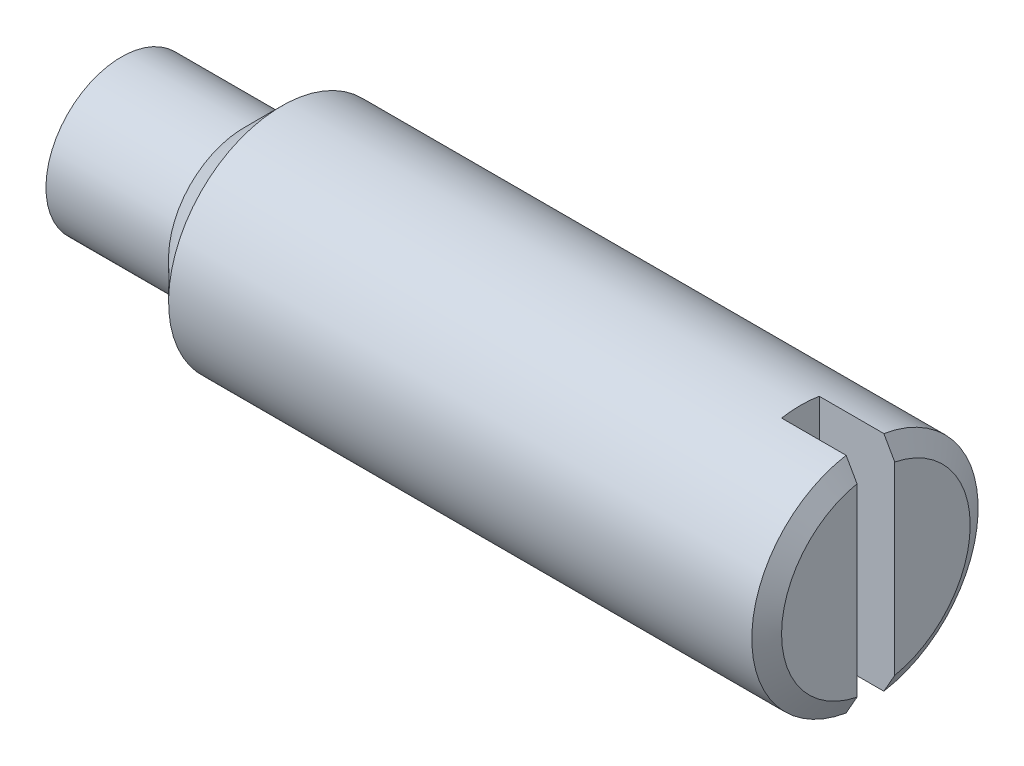
ISO-10303-21;
HEADER;
FILE_DESCRIPTION(('STEP AP214'),'2;1');
FILE_NAME('part.step','',(''),(''),'','','');
FILE_SCHEMA(('AUTOMOTIVE_DESIGN { 1 0 10303 214 1 1 1 1 }'));
ENDSEC;
DATA;
#1=APPLICATION_CONTEXT('core data for automotive mechanical design processes');
#2=APPLICATION_PROTOCOL_DEFINITION('international standard','automotive_design',2000,#1);
#3=PRODUCT_CONTEXT('',#1,'mechanical');
#4=PRODUCT('Part','Part','',(#3));
#5=PRODUCT_RELATED_PRODUCT_CATEGORY('part','',(#4));
#6=PRODUCT_DEFINITION_FORMATION('','',#4);
#7=PRODUCT_DEFINITION_CONTEXT('part definition',#1,'design');
#8=PRODUCT_DEFINITION('design','',#6,#7);
#9=PRODUCT_DEFINITION_SHAPE('','',#8);
#10=(LENGTH_UNIT() NAMED_UNIT(*) SI_UNIT(.MILLI.,.METRE.));
#11=(NAMED_UNIT(*) PLANE_ANGLE_UNIT() SI_UNIT($,.RADIAN.));
#12=(NAMED_UNIT(*) SI_UNIT($,.STERADIAN.) SOLID_ANGLE_UNIT());
#13=UNCERTAINTY_MEASURE_WITH_UNIT(LENGTH_MEASURE(1.E-05),#10,'distance_accuracy_value','');
#14=(GEOMETRIC_REPRESENTATION_CONTEXT(3) GLOBAL_UNCERTAINTY_ASSIGNED_CONTEXT((#13)) GLOBAL_UNIT_ASSIGNED_CONTEXT((#10,
#11,#12)) REPRESENTATION_CONTEXT('',''));
#15=CARTESIAN_POINT('',(0.,0.,0.));
#16=DIRECTION('',(0.,0.,1.));
#17=DIRECTION('',(1.,0.,0.));
#18=AXIS2_PLACEMENT_3D('',#15,#16,#17);
#19=CARTESIAN_POINT('',(0.,0.,0.));
#20=DIRECTION('',(-1.,0.,0.));
#21=DIRECTION('',(0.,-1.,0.));
#22=AXIS2_PLACEMENT_3D('',#19,#20,#21);
#23=PLANE('',#22);
#24=CARTESIAN_POINT('',(0.,0.,0.));
#25=DIRECTION('',(-1.,0.,0.));
#26=DIRECTION('',(0.,-1.,0.));
#27=AXIS2_PLACEMENT_3D('',#24,#25,#26);
#28=CIRCLE('',#27,2.5);
#29=CARTESIAN_POINT('',(0.,2.44948974278318,0.5));
#30=VERTEX_POINT('',#29);
#31=CARTESIAN_POINT('',(0.,-2.44948974278318,0.5));
#32=VERTEX_POINT('',#31);
#33=EDGE_CURVE('E97',#30,#32,#28,.F.);
#34=ORIENTED_EDGE('',*,*,#33,.T.);
#35=DIRECTION('',(0.,-1.,0.));
#36=VECTOR('',#35,1.);
#37=CARTESIAN_POINT('',(0.,3.,0.5));
#38=LINE('',#37,#36);
#39=EDGE_CURVE('E88',#30,#32,#38,.T.);
#40=ORIENTED_EDGE('',*,*,#39,.F.);
#41=EDGE_LOOP('',(#34,#40));
#42=FACE_BOUND('',#41,.T.);
#43=ADVANCED_FACE('F34',(#42),#23,.F.);
#44=CARTESIAN_POINT('',(-0.28867513459481,0.,0.));
#45=DIRECTION('',(-1.,0.,0.));
#46=DIRECTION('',(0.,-1.,0.));
#47=AXIS2_PLACEMENT_3D('',#44,#45,#46);
#48=CONICAL_SURFACE('',#47,3.,1.0471975511966);
#49=CARTESIAN_POINT('',(-2.38056763443478,6.60436425818802,0.500000000000001));
#50=CARTESIAN_POINT('',(-2.21987851924146,6.32523174882968,0.500000000000001));
#51=CARTESIAN_POINT('',(-2.05922157360592,6.04608066376051,0.500000000000001));
#52=CARTESIAN_POINT('',(-1.73804009670836,5.48769972280962,0.500000000000001));
#53=CARTESIAN_POINT('',(-1.57751556638557,5.20846986638771,0.500000000000001));
#54=CARTESIAN_POINT('',(-1.2565407328157,4.64966993381109,0.500000000000001));
#55=CARTESIAN_POINT('',(-1.09609059207058,4.37009976431178,0.500000000000001));
#56=CARTESIAN_POINT('',(-0.775536998569064,3.81076267874013,0.500000000000001));
#57=CARTESIAN_POINT('',(-0.615433543798454,3.53099576382344,0.5));
#58=CARTESIAN_POINT('',(-0.37637577587422,3.1120600016948,0.5));
#59=CARTESIAN_POINT('',(-0.297160111622826,2.97304032569814,0.5));
#60=CARTESIAN_POINT('',(-0.138988420983219,2.69485088787921,0.5));
#61=CARTESIAN_POINT('',(-0.0600323978569311,2.5556811242003,0.5));
#62=CARTESIAN_POINT('',(0.0974311986749842,2.27716790935011,0.5));
#63=CARTESIAN_POINT('',(0.175938952012067,2.13782455990923,0.5));
#64=CARTESIAN_POINT('',(0.332254601845675,1.8587504123645,0.5));
#65=CARTESIAN_POINT('',(0.410062522323292,1.71901962775318,0.5));
#66=CARTESIAN_POINT('',(0.52595587984706,1.50844816355613,0.5));
#67=CARTESIAN_POINT('',(0.564559286690378,1.43789288413285,0.5));
#68=CARTESIAN_POINT('',(0.641236776283347,1.29648675145502,0.5));
#69=CARTESIAN_POINT('',(0.679310815624552,1.22563587457343,0.5));
#70=CARTESIAN_POINT('',(0.754664782912789,1.08340551184132,0.5));
#71=CARTESIAN_POINT('',(0.791943721669441,1.01202550124295,0.5));
#72=CARTESIAN_POINT('',(0.865095276164039,0.868553497767773,0.5));
#73=CARTESIAN_POINT('',(0.900968141774855,0.796461634271076,0.5));
#74=CARTESIAN_POINT('',(0.95325850720774,0.686355987251272,0.5));
#75=CARTESIAN_POINT('',(0.970657040026667,0.64881097974156,0.5));
#76=CARTESIAN_POINT('',(1.00441838986475,0.573260592211893,0.5));
#77=CARTESIAN_POINT('',(1.02078132716098,0.535255266267751,0.5));
#78=CARTESIAN_POINT('',(1.05197331628164,0.458611875476108,0.5));
#79=CARTESIAN_POINT('',(1.06680257582864,0.419973897138829,0.5));
#80=CARTESIAN_POINT('',(1.09412756543042,0.341898309282545,0.5));
#81=CARTESIAN_POINT('',(1.10662424680626,0.302461033057007,0.5));
#82=CARTESIAN_POINT('',(1.13202721426478,0.207690397932789,0.5));
#83=CARTESIAN_POINT('',(1.14336747266767,0.151884665807046,0.5));
#84=CARTESIAN_POINT('',(1.15251769446273,0.0675083293957488,0.5));
#85=CARTESIAN_POINT('',(1.15426479869432,0.0393658599237505,0.5));
#86=CARTESIAN_POINT('',(1.15499132940951,-0.0169564875639498,0.5));
#87=CARTESIAN_POINT('',(1.15397080971083,-0.0451363648415895,0.5));
#88=CARTESIAN_POINT('',(1.14864112458689,-0.108852409201647,0.5));
#89=CARTESIAN_POINT('',(1.14351808647759,-0.144319501299168,0.5));
#90=CARTESIAN_POINT('',(1.12982343725853,-0.214588356873687,0.5));
#91=CARTESIAN_POINT('',(1.12124780317403,-0.249389294419736,0.5));
#92=CARTESIAN_POINT('',(1.10148661898386,-0.318726555770894,0.5));
#93=CARTESIAN_POINT('',(1.09026759135053,-0.353253062499702,0.5));
#94=CARTESIAN_POINT('',(1.06607493505895,-0.421660567235601,0.5));
#95=CARTESIAN_POINT('',(1.05310187440813,-0.455541770175561,0.5));
#96=CARTESIAN_POINT('',(1.02462222438818,-0.526079769021435,0.5));
#97=CARTESIAN_POINT('',(1.00899194292068,-0.56268607164306,0.5));
#98=CARTESIAN_POINT('',(0.976732347993736,-0.635458018455982,0.5));
#99=CARTESIAN_POINT('',(0.960102882364957,-0.671623594513533,0.5));
#100=CARTESIAN_POINT('',(0.909170463866859,-0.779665629677986,0.5));
#101=CARTESIAN_POINT('',(0.873837648323284,-0.851054129687489,0.5));
#102=CARTESIAN_POINT('',(0.801677165617376,-0.993202284908412,0.5));
#103=CARTESIAN_POINT('',(0.764847206453908,-1.06396075698513,0.5));
#104=CARTESIAN_POINT('',(0.690333807657301,-1.20499954369713,0.5));
#105=CARTESIAN_POINT('',(0.65265062439121,-1.27527999392158,0.5));
#106=CARTESIAN_POINT('',(0.576944940152225,-1.41516530621858,0.5));
#107=CARTESIAN_POINT('',(0.538925379534828,-1.48477176605077,0.5));
#108=CARTESIAN_POINT('',(0.462518575506405,-1.62378929563115,0.5));
#109=CARTESIAN_POINT('',(0.424131304361786,-1.69320035012234,0.5));
#110=CARTESIAN_POINT('',(0.308667411284188,-1.90108807371719,0.5));
#111=CARTESIAN_POINT('',(0.231214382532965,-2.03935544336329,0.5));
#112=CARTESIAN_POINT('',(0.0495084258521245,-2.36226425098842,0.5));
#113=CARTESIAN_POINT('',(-0.0549557382650398,-2.54678651233472,0.5));
#114=CARTESIAN_POINT('',(-0.264386143908598,-2.9155482780008,0.5));
#115=CARTESIAN_POINT('',(-0.369352391041683,-3.09978777913254,0.5));
#116=CARTESIAN_POINT('',(-0.684766827992471,-3.65241366414568,0.5));
#117=CARTESIAN_POINT('',(-0.895644275983684,-4.02055488747794,0.5));
#118=CARTESIAN_POINT('',(-1.31876314392062,-4.75813872384968,0.499999999999999));
#119=CARTESIAN_POINT('',(-1.53100654689369,-5.12758019749782,0.499999999999999));
#120=CARTESIAN_POINT('',(-1.95567562843016,-5.86614368002851,0.499999999999999));
#121=CARTESIAN_POINT('',(-2.16810118687258,-6.23526575796588,0.499999999999999));
#122=CARTESIAN_POINT('',(-2.38056763443478,-6.60436425818802,0.499999999999999));
#123=B_SPLINE_CURVE_WITH_KNOTS('',3,(#49,#50,#51,#52,#53,#54,#55,#56,#57,#58,#59,#60,#61,#62,
#63,#64,#65,#66,#67,#68,#69,#70,#71,#72,#73,#74,#75,#76,#77,#78,#79,#80,#81,#82,#83,#84,#85,#86,
#87,#88,#89,#90,#91,#92,#93,#94,#95,#96,#97,#98,#99,#100,#101,#102,#103,#104,#105,#106,#107,
#108,#109,#110,#111,#112,#113,#114,#115,#116,#117,#118,#119,#120,#121,#122),.UNSPECIFIED.,.F.,
.F.,(4,2,2,2,2,2,2,2,2,2,2,2,2,2,2,2,2,2,2,2,2,2,2,2,2,2,2,2,2,2,2,2,2,2,2,2,4),(0.,
0.966242049970543,1.93249089559998,2.89951386216376,3.86653119523923,4.34654597828595,
4.82656676899447,5.3063790081358,5.78617474248225,6.02745018292905,6.26874529278308,
6.5103248919116,6.75186136353196,6.8759915655814,7.00010732423173,7.12420625046749,
7.24825445295119,7.41829563097937,7.50275875677017,7.58722024014838,7.69449663624357,
7.80189839455179,7.91074134434513,8.01954913163642,8.13893807988061,8.25834525660899,
8.49726798317976,8.73657137670712,8.97580379701663,9.21374141549945,9.45169712335604,
9.92714322687762,10.5632638036887,11.1993915006302,12.4721728808097,13.7503779958125,
15.0280247623734),.UNSPECIFIED.);
#124=CARTESIAN_POINT('',(-0.28867513459481,2.95803989154981,0.5));
#125=VERTEX_POINT('',#124);
#126=EDGE_CURVE('E85',#125,#30,#123,.T.);
#127=ORIENTED_EDGE('',*,*,#126,.F.);
#128=CARTESIAN_POINT('',(-0.28867513459481,0.,0.));
#129=DIRECTION('',(-1.,0.,0.));
#130=DIRECTION('',(0.,-1.,0.));
#131=AXIS2_PLACEMENT_3D('',#128,#129,#130);
#132=CIRCLE('',#131,3.);
#133=CARTESIAN_POINT('',(-0.288675134594809,-2.95803989154981,0.5));
#134=VERTEX_POINT('',#133);
#135=EDGE_CURVE('E101',#134,#125,#132,.T.);
#136=ORIENTED_EDGE('',*,*,#135,.F.);
#137=EDGE_CURVE('E94',#32,#134,#123,.T.);
#138=ORIENTED_EDGE('',*,*,#137,.F.);
#139=ORIENTED_EDGE('',*,*,#33,.F.);
#140=EDGE_LOOP('',(#127,#136,#138,#139));
#141=FACE_BOUND('',#140,.T.);
#142=ADVANCED_FACE('F99',(#141),#48,.T.);
#143=CARTESIAN_POINT('',(0.,-2.44948974278318,-0.5));
#144=VERTEX_POINT('',#143);
#145=CARTESIAN_POINT('',(0.,2.44948974278318,-0.5));
#146=VERTEX_POINT('',#145);
#147=EDGE_CURVE('E100',#144,#146,#28,.F.);
#148=ORIENTED_EDGE('',*,*,#147,.T.);
#149=DIRECTION('',(0.,1.,0.));
#150=VECTOR('',#149,1.);
#151=CARTESIAN_POINT('',(0.,3.,-0.5));
#152=LINE('',#151,#150);
#153=EDGE_CURVE('E50',#144,#146,#152,.T.);
#154=ORIENTED_EDGE('',*,*,#153,.F.);
#155=EDGE_LOOP('',(#148,#154));
#156=FACE_BOUND('',#155,.T.);
#157=ADVANCED_FACE('F140',(#156),#23,.F.);
#158=CARTESIAN_POINT('',(-20.,0.,0.));
#159=DIRECTION('',(-1.,0.,0.));
#160=DIRECTION('',(0.,-1.,0.));
#161=AXIS2_PLACEMENT_3D('',#158,#159,#160);
#162=CYLINDRICAL_SURFACE('',#161,3.);
#163=ORIENTED_EDGE('',*,*,#135,.T.);
#164=DIRECTION('',(-1.,0.,0.));
#165=VECTOR('',#164,1.);
#166=CARTESIAN_POINT('',(-20.,2.95803989154981,0.5));
#167=LINE('',#166,#165);
#168=CARTESIAN_POINT('',(-2.,2.95803989154981,0.5));
#169=VERTEX_POINT('',#168);
#170=EDGE_CURVE('E58',#125,#169,#167,.T.);
#171=ORIENTED_EDGE('',*,*,#170,.T.);
#172=CARTESIAN_POINT('',(-2.,0.,0.));
#173=DIRECTION('',(1.,0.,0.));
#174=DIRECTION('',(0.,0.,-1.));
#175=AXIS2_PLACEMENT_3D('',#172,#173,#174);
#176=CIRCLE('',#175,3.);
#177=CARTESIAN_POINT('',(-2.,2.95803989154981,-0.5));
#178=VERTEX_POINT('',#177);
#179=EDGE_CURVE('E11',#178,#169,#176,.T.);
#180=ORIENTED_EDGE('',*,*,#179,.F.);
#181=DIRECTION('',(-1.,0.,0.));
#182=VECTOR('',#181,1.);
#183=CARTESIAN_POINT('',(-20.,2.95803989154981,-0.5));
#184=LINE('',#183,#182);
#185=CARTESIAN_POINT('',(-0.28867513459481,2.95803989154981,-0.5));
#186=VERTEX_POINT('',#185);
#187=EDGE_CURVE('E208',#178,#186,#184,.F.);
#188=ORIENTED_EDGE('',*,*,#187,.T.);
#189=CARTESIAN_POINT('',(-0.288675134594809,-2.95803989154981,-0.5));
#190=VERTEX_POINT('',#189);
#191=EDGE_CURVE('E105',#186,#190,#132,.T.);
#192=ORIENTED_EDGE('',*,*,#191,.T.);
#193=DIRECTION('',(-1.,0.,0.));
#194=VECTOR('',#193,1.);
#195=CARTESIAN_POINT('',(-20.,-2.95803989154981,-0.5));
#196=LINE('',#195,#194);
#197=CARTESIAN_POINT('',(-2.,-2.95803989154981,-0.5));
#198=VERTEX_POINT('',#197);
#199=EDGE_CURVE('E212',#190,#198,#196,.T.);
#200=ORIENTED_EDGE('',*,*,#199,.T.);
#201=CARTESIAN_POINT('',(-2.,-2.95803989154981,0.5));
#202=VERTEX_POINT('',#201);
#203=EDGE_CURVE('E39',#202,#198,#176,.T.);
#204=ORIENTED_EDGE('',*,*,#203,.F.);
#205=DIRECTION('',(-1.,0.,0.));
#206=VECTOR('',#205,1.);
#207=CARTESIAN_POINT('',(-20.,-2.95803989154981,0.5));
#208=LINE('',#207,#206);
#209=EDGE_CURVE('E218',#202,#134,#208,.F.);
#210=ORIENTED_EDGE('',*,*,#209,.T.);
#211=EDGE_LOOP('',(#163,#171,#180,#188,#192,#200,#204,#210));
#212=FACE_BOUND('',#211,.T.);
#213=CARTESIAN_POINT('',(-15.75,0.,0.));
#214=DIRECTION('',(-1.,0.,0.));
#215=DIRECTION('',(0.,-1.,0.));
#216=AXIS2_PLACEMENT_3D('',#213,#214,#215);
#217=CIRCLE('',#216,3.);
#218=CARTESIAN_POINT('',(-15.75,-3.,0.));
#219=VERTEX_POINT('',#218);
#220=EDGE_CURVE('E227',#219,#219,#217,.T.);
#221=ORIENTED_EDGE('',*,*,#220,.F.);
#222=EDGE_LOOP('',(#221));
#223=FACE_BOUND('',#222,.T.);
#224=ADVANCED_FACE('F137',(#212,#223),#162,.T.);
#225=CARTESIAN_POINT('',(-15.75,0.,0.));
#226=DIRECTION('',(1.,0.,0.));
#227=DIRECTION('',(0.,1.,0.));
#228=AXIS2_PLACEMENT_3D('',#225,#226,#227);
#229=CONICAL_SURFACE('',#228,3.,0.78539816339745);
#230=CARTESIAN_POINT('',(-16.75,0.,0.));
#231=DIRECTION('',(-1.,0.,0.));
#232=DIRECTION('',(0.,-1.,0.));
#233=AXIS2_PLACEMENT_3D('',#230,#231,#232);
#234=CIRCLE('',#233,2.);
#235=CARTESIAN_POINT('',(-16.75,-2.,0.));
#236=VERTEX_POINT('',#235);
#237=EDGE_CURVE('E225',#236,#236,#234,.T.);
#238=ORIENTED_EDGE('',*,*,#237,.F.);
#239=EDGE_LOOP('',(#238));
#240=FACE_BOUND('',#239,.T.);
#241=ORIENTED_EDGE('',*,*,#220,.T.);
#242=EDGE_LOOP('',(#241));
#243=FACE_BOUND('',#242,.T.);
#244=ADVANCED_FACE('F133',(#240,#243),#229,.T.);
#245=CARTESIAN_POINT('',(-20.,0.,0.));
#246=DIRECTION('',(-1.,0.,0.));
#247=DIRECTION('',(0.,-1.,0.));
#248=AXIS2_PLACEMENT_3D('',#245,#246,#247);
#249=CYLINDRICAL_SURFACE('',#248,2.);
#250=CARTESIAN_POINT('',(-20.,0.,0.));
#251=DIRECTION('',(-1.,0.,0.));
#252=DIRECTION('',(0.,-1.,0.));
#253=AXIS2_PLACEMENT_3D('',#250,#251,#252);
#254=CIRCLE('',#253,2.);
#255=CARTESIAN_POINT('',(-20.,-2.,0.));
#256=VERTEX_POINT('',#255);
#257=EDGE_CURVE('E222',#256,#256,#254,.T.);
#258=ORIENTED_EDGE('',*,*,#257,.F.);
#259=EDGE_LOOP('',(#258));
#260=FACE_BOUND('',#259,.T.);
#261=ORIENTED_EDGE('',*,*,#237,.T.);
#262=EDGE_LOOP('',(#261));
#263=FACE_BOUND('',#262,.T.);
#264=ADVANCED_FACE('F129',(#260,#263),#249,.T.);
#265=CARTESIAN_POINT('',(-20.,2.,0.));
#266=DIRECTION('',(1.,0.,0.));
#267=DIRECTION('',(0.,1.,0.));
#268=AXIS2_PLACEMENT_3D('',#265,#266,#267);
#269=PLANE('',#268);
#270=ORIENTED_EDGE('',*,*,#257,.T.);
#271=EDGE_LOOP('',(#270));
#272=FACE_BOUND('',#271,.T.);
#273=ADVANCED_FACE('F126',(#272),#269,.F.);
#274=CARTESIAN_POINT('',(-2.38056763443478,-6.60436425818802,-0.500000000000001));
#275=CARTESIAN_POINT('',(-2.21987851924146,-6.32523174882968,-0.500000000000001));
#276=CARTESIAN_POINT('',(-2.05922157360592,-6.04608066376051,-0.500000000000001));
#277=CARTESIAN_POINT('',(-1.73804009670836,-5.48769972280962,-0.500000000000001));
#278=CARTESIAN_POINT('',(-1.57751556638557,-5.20846986638771,-0.500000000000001));
#279=CARTESIAN_POINT('',(-1.2565407328157,-4.64966993381109,-0.500000000000001));
#280=CARTESIAN_POINT('',(-1.09609059207058,-4.37009976431178,-0.5));
#281=CARTESIAN_POINT('',(-0.775536998569061,-3.81076267874013,-0.5));
#282=CARTESIAN_POINT('',(-0.615433543798452,-3.53099576382344,-0.5));
#283=CARTESIAN_POINT('',(-0.376375775874218,-3.1120600016948,-0.5));
#284=CARTESIAN_POINT('',(-0.297160111622824,-2.97304032569814,-0.5));
#285=CARTESIAN_POINT('',(-0.138988420983216,-2.69485088787921,-0.5));
#286=CARTESIAN_POINT('',(-0.0600323978569287,-2.5556811242003,-0.5));
#287=CARTESIAN_POINT('',(0.0974311986749863,-2.27716790935011,-0.5));
#288=CARTESIAN_POINT('',(0.175938952012069,-2.13782455990922,-0.5));
#289=CARTESIAN_POINT('',(0.332254601845677,-1.8587504123645,-0.5));
#290=CARTESIAN_POINT('',(0.410062522323294,-1.71901962775317,-0.5));
#291=CARTESIAN_POINT('',(0.525955879847061,-1.50844816355613,-0.5));
#292=CARTESIAN_POINT('',(0.564559286690379,-1.43789288413285,-0.5));
#293=CARTESIAN_POINT('',(0.641236776283348,-1.29648675145502,-0.5));
#294=CARTESIAN_POINT('',(0.679310815624553,-1.22563587457343,-0.5));
#295=CARTESIAN_POINT('',(0.75466478291279,-1.08340551184132,-0.5));
#296=CARTESIAN_POINT('',(0.791943721669442,-1.01202550124295,-0.5));
#297=CARTESIAN_POINT('',(0.86509527616404,-0.868553497767773,-0.5));
#298=CARTESIAN_POINT('',(0.900968141774856,-0.796461634271076,-0.5));
#299=CARTESIAN_POINT('',(0.95325850720774,-0.686355987251272,-0.5));
#300=CARTESIAN_POINT('',(0.970657040026667,-0.64881097974156,-0.5));
#301=CARTESIAN_POINT('',(1.00441838986475,-0.573260592211892,-0.5));
#302=CARTESIAN_POINT('',(1.02078132716098,-0.53525526626775,-0.5));
#303=CARTESIAN_POINT('',(1.05197331628164,-0.458611875476108,-0.5));
#304=CARTESIAN_POINT('',(1.06680257582864,-0.419973897138829,-0.5));
#305=CARTESIAN_POINT('',(1.09412756543042,-0.341898309282545,-0.5));
#306=CARTESIAN_POINT('',(1.10662424680626,-0.302461033057006,-0.5));
#307=CARTESIAN_POINT('',(1.13202721426478,-0.207690397932788,-0.5));
#308=CARTESIAN_POINT('',(1.14336747266767,-0.151884665807046,-0.5));
#309=CARTESIAN_POINT('',(1.15251769446273,-0.067508329395748,-0.5));
#310=CARTESIAN_POINT('',(1.15426479869432,-0.0393658599237494,-0.5));
#311=CARTESIAN_POINT('',(1.15499132940951,0.0169564875639509,-0.5));
#312=CARTESIAN_POINT('',(1.15397080971083,0.0451363648415903,-0.5));
#313=CARTESIAN_POINT('',(1.14864112458689,0.108852409201648,-0.5));
#314=CARTESIAN_POINT('',(1.14351808647759,0.144319501299169,-0.5));
#315=CARTESIAN_POINT('',(1.12982343725853,0.214588356873687,-0.5));
#316=CARTESIAN_POINT('',(1.12124780317403,0.249389294419737,-0.5));
#317=CARTESIAN_POINT('',(1.10148661898386,0.318726555770895,-0.5));
#318=CARTESIAN_POINT('',(1.09026759135053,0.353253062499703,-0.5));
#319=CARTESIAN_POINT('',(1.06607493505895,0.421660567235602,-0.5));
#320=CARTESIAN_POINT('',(1.05310187440813,0.455541770175562,-0.5));
#321=CARTESIAN_POINT('',(1.02462222438818,0.526079769021436,-0.5));
#322=CARTESIAN_POINT('',(1.00899194292068,0.562686071643062,-0.5));
#323=CARTESIAN_POINT('',(0.976732347993736,0.635458018455984,-0.5));
#324=CARTESIAN_POINT('',(0.960102882364957,0.671623594513534,-0.5));
#325=CARTESIAN_POINT('',(0.909170463866858,0.779665629677987,-0.5));
#326=CARTESIAN_POINT('',(0.873837648323283,0.851054129687489,-0.5));
#327=CARTESIAN_POINT('',(0.801677165617375,0.993202284908413,-0.5));
#328=CARTESIAN_POINT('',(0.764847206453907,1.06396075698513,-0.5));
#329=CARTESIAN_POINT('',(0.6903338076573,1.20499954369713,-0.5));
#330=CARTESIAN_POINT('',(0.652650624391209,1.27527999392158,-0.5));
#331=CARTESIAN_POINT('',(0.576944940152225,1.41516530621858,-0.5));
#332=CARTESIAN_POINT('',(0.538925379534828,1.48477176605077,-0.5));
#333=CARTESIAN_POINT('',(0.462518575506404,1.62378929563115,-0.5));
#334=CARTESIAN_POINT('',(0.424131304361786,1.69320035012234,-0.5));
#335=CARTESIAN_POINT('',(0.308667411284187,1.90108807371719,-0.5));
#336=CARTESIAN_POINT('',(0.231214382532963,2.03935544336329,-0.5));
#337=CARTESIAN_POINT('',(0.0495084258521223,2.36226425098842,-0.5));
#338=CARTESIAN_POINT('',(-0.0549557382650423,2.54678651233473,-0.5));
#339=CARTESIAN_POINT('',(-0.264386143908601,2.9155482780008,-0.5));
#340=CARTESIAN_POINT('',(-0.369352391041686,3.09978777913254,-0.5));
#341=CARTESIAN_POINT('',(-0.684766827992474,3.65241366414569,-0.5));
#342=CARTESIAN_POINT('',(-0.895644275983687,4.02055488747794,-0.499999999999999));
#343=CARTESIAN_POINT('',(-1.31876314392062,4.75813872384968,-0.499999999999999));
#344=CARTESIAN_POINT('',(-1.53100654689369,5.12758019749782,-0.499999999999999));
#345=CARTESIAN_POINT('',(-1.95567562843016,5.86614368002851,-0.499999999999999));
#346=CARTESIAN_POINT('',(-2.16810118687258,6.23526575796589,-0.499999999999999));
#347=CARTESIAN_POINT('',(-2.38056763443478,6.60436425818802,-0.499999999999999));
#348=B_SPLINE_CURVE_WITH_KNOTS('',3,(#274,#275,#276,#277,#278,#279,#280,#281,#282,#283,#284,
#285,#286,#287,#288,#289,#290,#291,#292,#293,#294,#295,#296,#297,#298,#299,#300,#301,#302,#303,
#304,#305,#306,#307,#308,#309,#310,#311,#312,#313,#314,#315,#316,#317,#318,#319,#320,#321,#322,
#323,#324,#325,#326,#327,#328,#329,#330,#331,#332,#333,#334,#335,#336,#337,#338,#339,#340,#341,
#342,#343,#344,#345,#346,#347),.UNSPECIFIED.,.F.,.F.,(4,2,2,2,2,2,2,2,2,2,2,2,2,2,2,2,2,2,2,2,2,
2,2,2,2,2,2,2,2,2,2,2,2,2,2,2,4),(0.,0.966242049970541,1.93249089559997,2.89951386216376,
3.86653119523924,4.34654597828596,4.82656676899447,5.30637900813581,5.78617474248225,
6.02745018292905,6.26874529278309,6.5103248919116,6.75186136353196,6.87599156558141,
7.00010732423173,7.12420625046749,7.2482544529512,7.41829563097937,7.50275875677017,
7.58722024014839,7.69449663624357,7.80189839455179,7.91074134434514,8.01954913163643,
8.13893807988061,8.258345256609,8.49726798317976,8.73657137670712,8.97580379701663,
9.21374141549946,9.45169712335605,9.92714322687763,10.5632638036887,11.1993915006302,
12.4721728808097,13.7503779958125,15.0280247623734),.UNSPECIFIED.);
#349=EDGE_CURVE('E113',#190,#144,#348,.T.);
#350=ORIENTED_EDGE('',*,*,#349,.F.);
#351=ORIENTED_EDGE('',*,*,#191,.F.);
#352=EDGE_CURVE('E104',#146,#186,#348,.T.);
#353=ORIENTED_EDGE('',*,*,#352,.F.);
#354=ORIENTED_EDGE('',*,*,#147,.F.);
#355=EDGE_LOOP('',(#350,#351,#353,#354));
#356=FACE_BOUND('',#355,.T.);
#357=ADVANCED_FACE('F36',(#356),#48,.T.);
#358=CARTESIAN_POINT('',(-2.,-3.,0.5));
#359=DIRECTION('',(1.,0.,0.));
#360=DIRECTION('',(0.,0.,-1.));
#361=AXIS2_PLACEMENT_3D('',#358,#359,#360);
#362=PLANE('',#361);
#363=DIRECTION('',(0.,1.,0.));
#364=VECTOR('',#363,1.);
#365=CARTESIAN_POINT('',(-2.,3.,-0.5));
#366=LINE('',#365,#364);
#367=EDGE_CURVE('E204',#198,#178,#366,.T.);
#368=ORIENTED_EDGE('',*,*,#367,.T.);
#369=ORIENTED_EDGE('',*,*,#179,.T.);
#370=DIRECTION('',(0.,-1.,0.));
#371=VECTOR('',#370,1.);
#372=CARTESIAN_POINT('',(-2.,3.,0.5));
#373=LINE('',#372,#371);
#374=EDGE_CURVE('E209',#169,#202,#373,.T.);
#375=ORIENTED_EDGE('',*,*,#374,.T.);
#376=ORIENTED_EDGE('',*,*,#203,.T.);
#377=EDGE_LOOP('',(#368,#369,#375,#376));
#378=FACE_BOUND('',#377,.T.);
#379=ADVANCED_FACE('F122',(#378),#362,.T.);
#380=CARTESIAN_POINT('',(-2.,3.,0.5));
#381=DIRECTION('',(0.,0.,1.));
#382=DIRECTION('',(0.,-1.,0.));
#383=AXIS2_PLACEMENT_3D('',#380,#381,#382);
#384=PLANE('',#383);
#385=ORIENTED_EDGE('',*,*,#126,.T.);
#386=ORIENTED_EDGE('',*,*,#39,.T.);
#387=ORIENTED_EDGE('',*,*,#137,.T.);
#388=ORIENTED_EDGE('',*,*,#209,.F.);
#389=ORIENTED_EDGE('',*,*,#374,.F.);
#390=ORIENTED_EDGE('',*,*,#170,.F.);
#391=EDGE_LOOP('',(#385,#386,#387,#388,#389,#390));
#392=FACE_BOUND('',#391,.T.);
#393=ADVANCED_FACE('F87',(#392),#384,.F.);
#394=CARTESIAN_POINT('',(-2.,3.,-0.5));
#395=DIRECTION('',(0.,0.,-1.));
#396=DIRECTION('',(0.,1.,0.));
#397=AXIS2_PLACEMENT_3D('',#394,#395,#396);
#398=PLANE('',#397);
#399=ORIENTED_EDGE('',*,*,#349,.T.);
#400=ORIENTED_EDGE('',*,*,#153,.T.);
#401=ORIENTED_EDGE('',*,*,#352,.T.);
#402=ORIENTED_EDGE('',*,*,#187,.F.);
#403=ORIENTED_EDGE('',*,*,#367,.F.);
#404=ORIENTED_EDGE('',*,*,#199,.F.);
#405=EDGE_LOOP('',(#399,#400,#401,#402,#403,#404));
#406=FACE_BOUND('',#405,.T.);
#407=ADVANCED_FACE('F118',(#406),#398,.F.);
#408=CLOSED_SHELL('',(#43,#142,#157,#224,#244,#264,#273,#357,#379,#393,#407));
#409=MANIFOLD_SOLID_BREP('B2',#408);
#410=ADVANCED_BREP_SHAPE_REPRESENTATION('',(#18,#409),#14);
#411=SHAPE_DEFINITION_REPRESENTATION(#9,#410);
ENDSEC;
END-ISO-10303-21;
